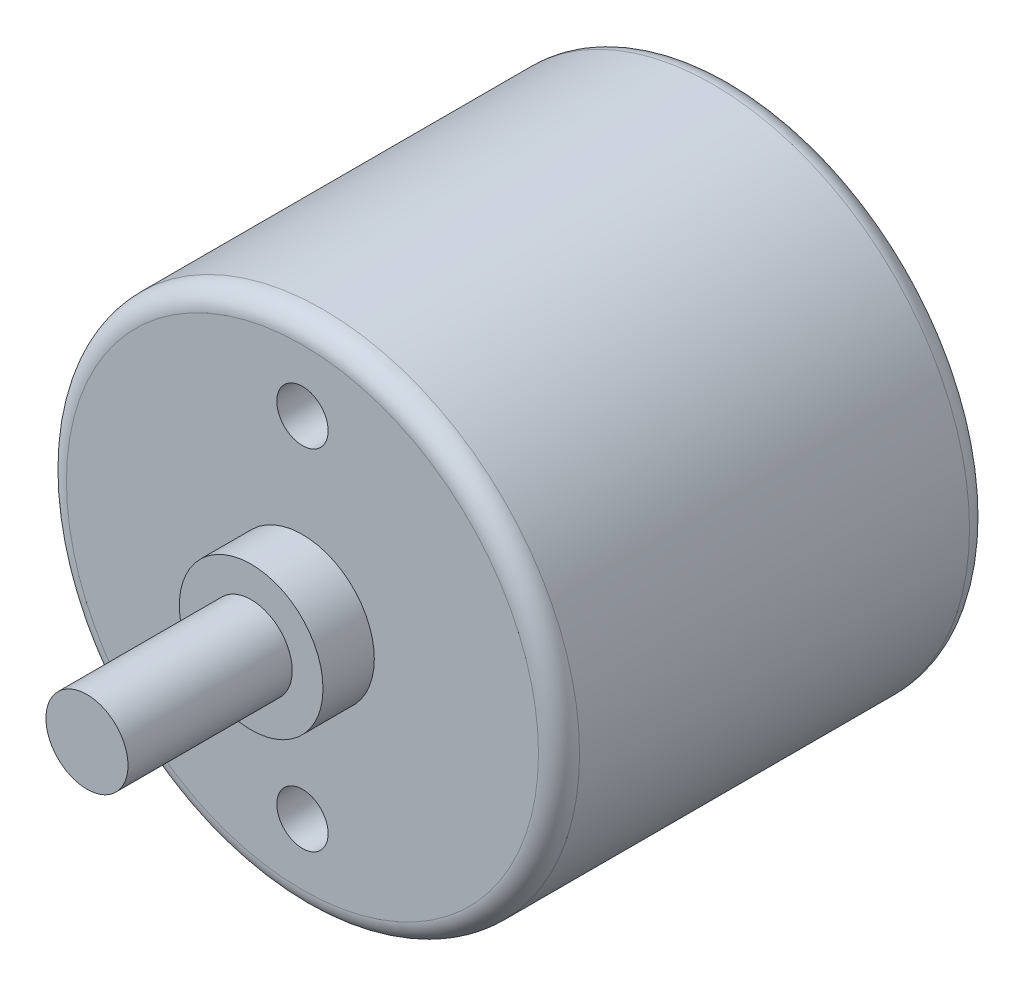
ISO-10303-21;
HEADER;
FILE_DESCRIPTION(('STEP AP214'),'2;1');
FILE_NAME('part.step','',(''),(''),'','','');
FILE_SCHEMA(('AUTOMOTIVE_DESIGN { 1 0 10303 214 1 1 1 1 }'));
ENDSEC;
DATA;
#1=APPLICATION_CONTEXT('core data for automotive mechanical design processes');
#2=APPLICATION_PROTOCOL_DEFINITION('international standard','automotive_design',2000,#1);
#3=PRODUCT_CONTEXT('',#1,'mechanical');
#4=PRODUCT('Part','Part','',(#3));
#5=PRODUCT_RELATED_PRODUCT_CATEGORY('part','',(#4));
#6=PRODUCT_DEFINITION_FORMATION('','',#4);
#7=PRODUCT_DEFINITION_CONTEXT('part definition',#1,'design');
#8=PRODUCT_DEFINITION('design','',#6,#7);
#9=PRODUCT_DEFINITION_SHAPE('','',#8);
#10=(LENGTH_UNIT() NAMED_UNIT(*) SI_UNIT(.MILLI.,.METRE.));
#11=(NAMED_UNIT(*) PLANE_ANGLE_UNIT() SI_UNIT($,.RADIAN.));
#12=(NAMED_UNIT(*) SI_UNIT($,.STERADIAN.) SOLID_ANGLE_UNIT());
#13=UNCERTAINTY_MEASURE_WITH_UNIT(LENGTH_MEASURE(1.E-05),#10,'distance_accuracy_value','');
#14=(GEOMETRIC_REPRESENTATION_CONTEXT(3) GLOBAL_UNCERTAINTY_ASSIGNED_CONTEXT((#13)) GLOBAL_UNIT_ASSIGNED_CONTEXT((#10,
#11,#12)) REPRESENTATION_CONTEXT('',''));
#15=CARTESIAN_POINT('',(0.,0.,0.));
#16=DIRECTION('',(0.,0.,1.));
#17=DIRECTION('',(1.,0.,0.));
#18=AXIS2_PLACEMENT_3D('',#15,#16,#17);
#19=CARTESIAN_POINT('',(0.,0.,23.5));
#20=DIRECTION('',(0.,0.,1.));
#21=DIRECTION('',(1.,0.,0.));
#22=AXIS2_PLACEMENT_3D('',#19,#20,#21);
#23=PLANE('',#22);
#24=CARTESIAN_POINT('',(0.,0.,23.5));
#25=DIRECTION('',(0.,0.,1.));
#26=DIRECTION('',(1.,0.,0.));
#27=AXIS2_PLACEMENT_3D('',#24,#25,#26);
#28=CIRCLE('',#27,3.5);
#29=CARTESIAN_POINT('',(3.5,0.,23.5));
#30=VERTEX_POINT('',#29);
#31=EDGE_CURVE('E53',#30,#30,#28,.T.);
#32=ORIENTED_EDGE('',*,*,#31,.T.);
#33=EDGE_LOOP('',(#32));
#34=FACE_BOUND('',#33,.T.);
#35=CARTESIAN_POINT('',(0.,0.,23.5));
#36=DIRECTION('',(0.,0.,1.));
#37=DIRECTION('',(1.,0.,0.));
#38=AXIS2_PLACEMENT_3D('',#35,#36,#37);
#39=CIRCLE('',#38,2.);
#40=CARTESIAN_POINT('',(2.,0.,23.5));
#41=VERTEX_POINT('',#40);
#42=EDGE_CURVE('E60',#41,#41,#39,.T.);
#43=ORIENTED_EDGE('',*,*,#42,.F.);
#44=EDGE_LOOP('',(#43));
#45=FACE_BOUND('',#44,.T.);
#46=ADVANCED_FACE('F33',(#34,#45),#23,.T.);
#47=CARTESIAN_POINT('',(0.,0.,21.));
#48=DIRECTION('',(0.,0.,1.));
#49=DIRECTION('',(1.,0.,0.));
#50=AXIS2_PLACEMENT_3D('',#47,#48,#49);
#51=PLANE('',#50);
#52=CARTESIAN_POINT('',(-3.65088646996817E-13,-8.5,21.));
#53=DIRECTION('',(0.,0.,1.));
#54=DIRECTION('',(1.,0.,0.));
#55=AXIS2_PLACEMENT_3D('',#52,#53,#54);
#56=CIRCLE('',#55,1.25);
#57=CARTESIAN_POINT('',(1.24999999999964,-8.5,21.));
#58=VERTEX_POINT('',#57);
#59=EDGE_CURVE('E72',#58,#58,#56,.T.);
#60=ORIENTED_EDGE('',*,*,#59,.F.);
#61=EDGE_LOOP('',(#60));
#62=FACE_BOUND('',#61,.T.);
#63=CARTESIAN_POINT('',(-3.05599595380992E-13,8.5,21.));
#64=DIRECTION('',(0.,0.,1.));
#65=DIRECTION('',(1.,0.,0.));
#66=AXIS2_PLACEMENT_3D('',#63,#64,#65);
#67=CIRCLE('',#66,1.25);
#68=CARTESIAN_POINT('',(1.2499999999997,8.5,21.));
#69=VERTEX_POINT('',#68);
#70=EDGE_CURVE('E66',#69,#69,#67,.T.);
#71=ORIENTED_EDGE('',*,*,#70,.F.);
#72=EDGE_LOOP('',(#71));
#73=FACE_BOUND('',#72,.T.);
#74=CARTESIAN_POINT('',(0.,0.,21.));
#75=DIRECTION('',(0.,0.,1.));
#76=DIRECTION('',(1.,0.,0.));
#77=AXIS2_PLACEMENT_3D('',#74,#75,#76);
#78=CIRCLE('',#77,11.5);
#79=CARTESIAN_POINT('',(11.5,0.,21.));
#80=VERTEX_POINT('',#79);
#81=EDGE_CURVE('E10',#80,#80,#78,.T.);
#82=ORIENTED_EDGE('',*,*,#81,.T.);
#83=EDGE_LOOP('',(#82));
#84=FACE_BOUND('',#83,.T.);
#85=CARTESIAN_POINT('',(0.,0.,21.));
#86=DIRECTION('',(0.,0.,1.));
#87=DIRECTION('',(1.,0.,0.));
#88=AXIS2_PLACEMENT_3D('',#85,#86,#87);
#89=CIRCLE('',#88,3.5);
#90=CARTESIAN_POINT('',(3.5,0.,21.));
#91=VERTEX_POINT('',#90);
#92=EDGE_CURVE('E54',#91,#91,#89,.T.);
#93=ORIENTED_EDGE('',*,*,#92,.F.);
#94=EDGE_LOOP('',(#93));
#95=FACE_BOUND('',#94,.T.);
#96=ADVANCED_FACE('F87',(#62,#73,#84,#95),#51,.T.);
#97=CARTESIAN_POINT('',(0.,0.,21.));
#98=DIRECTION('',(0.,0.,-1.));
#99=DIRECTION('',(-1.,0.,0.));
#100=AXIS2_PLACEMENT_3D('',#97,#98,#99);
#101=CYLINDRICAL_SURFACE('',#100,12.5);
#102=CARTESIAN_POINT('',(0.,0.,1.));
#103=DIRECTION('',(0.,0.,1.));
#104=DIRECTION('',(1.,0.,0.));
#105=AXIS2_PLACEMENT_3D('',#102,#103,#104);
#106=CIRCLE('',#105,12.5);
#107=CARTESIAN_POINT('',(-12.5,0.,1.));
#108=VERTEX_POINT('',#107);
#109=EDGE_CURVE('E44',#108,#108,#106,.T.);
#110=CARTESIAN_POINT('',(0.,0.,20.));
#111=DIRECTION('',(0.,0.,1.));
#112=DIRECTION('',(1.,0.,0.));
#113=AXIS2_PLACEMENT_3D('',#110,#111,#112);
#114=CIRCLE('',#113,12.5);
#115=CARTESIAN_POINT('',(-12.5,0.,20.));
#116=VERTEX_POINT('',#115);
#117=EDGE_CURVE('E48',#116,#116,#114,.F.);
#118=CARTESIAN_POINT('',(-12.5,0.,1.));
#119=CARTESIAN_POINT('',(-12.5,0.,1.19791666666667));
#120=CARTESIAN_POINT('',(-12.5,0.,1.39583333333333));
#121=CARTESIAN_POINT('',(-12.5,0.,1.79166666666667));
#122=CARTESIAN_POINT('',(-12.5,0.,1.98958333333334));
#123=CARTESIAN_POINT('',(-12.5,0.,2.38541666666667));
#124=CARTESIAN_POINT('',(-12.5,0.,2.58333333333334));
#125=CARTESIAN_POINT('',(-12.5,0.,2.97916666666667));
#126=CARTESIAN_POINT('',(-12.5,0.,3.17708333333334));
#127=CARTESIAN_POINT('',(-12.5,0.,3.57291666666667));
#128=CARTESIAN_POINT('',(-12.5,0.,3.77083333333333));
#129=CARTESIAN_POINT('',(-12.5,0.,4.16666666666667));
#130=CARTESIAN_POINT('',(-12.5,0.,4.36458333333333));
#131=CARTESIAN_POINT('',(-12.5,0.,4.76041666666667));
#132=CARTESIAN_POINT('',(-12.5,0.,4.95833333333333));
#133=CARTESIAN_POINT('',(-12.5,0.,5.35416666666667));
#134=CARTESIAN_POINT('',(-12.5,0.,5.55208333333333));
#135=CARTESIAN_POINT('',(-12.5,0.,5.94791666666667));
#136=CARTESIAN_POINT('',(-12.5,0.,6.14583333333333));
#137=CARTESIAN_POINT('',(-12.5,0.,6.54166666666667));
#138=CARTESIAN_POINT('',(-12.5,0.,6.73958333333333));
#139=CARTESIAN_POINT('',(-12.5,0.,7.13541666666667));
#140=CARTESIAN_POINT('',(-12.5,0.,7.33333333333333));
#141=CARTESIAN_POINT('',(-12.5,0.,7.72916666666667));
#142=CARTESIAN_POINT('',(-12.5,0.,7.92708333333333));
#143=CARTESIAN_POINT('',(-12.5,0.,8.32291666666667));
#144=CARTESIAN_POINT('',(-12.5,0.,8.52083333333333));
#145=CARTESIAN_POINT('',(-12.5,0.,8.91666666666667));
#146=CARTESIAN_POINT('',(-12.5,0.,9.11458333333333));
#147=CARTESIAN_POINT('',(-12.5,0.,9.51041666666667));
#148=CARTESIAN_POINT('',(-12.5,0.,9.70833333333333));
#149=CARTESIAN_POINT('',(-12.5,0.,10.1041666666667));
#150=CARTESIAN_POINT('',(-12.5,0.,10.3020833333333));
#151=CARTESIAN_POINT('',(-12.5,0.,10.6979166666667));
#152=CARTESIAN_POINT('',(-12.5,0.,10.8958333333333));
#153=CARTESIAN_POINT('',(-12.5,0.,11.2916666666667));
#154=CARTESIAN_POINT('',(-12.5,0.,11.4895833333333));
#155=CARTESIAN_POINT('',(-12.5,0.,11.8854166666667));
#156=CARTESIAN_POINT('',(-12.5,0.,12.0833333333333));
#157=CARTESIAN_POINT('',(-12.5,0.,12.4791666666667));
#158=CARTESIAN_POINT('',(-12.5,0.,12.6770833333333));
#159=CARTESIAN_POINT('',(-12.5,0.,13.0729166666667));
#160=CARTESIAN_POINT('',(-12.5,0.,13.2708333333333));
#161=CARTESIAN_POINT('',(-12.5,0.,13.6666666666667));
#162=CARTESIAN_POINT('',(-12.5,0.,13.8645833333333));
#163=CARTESIAN_POINT('',(-12.5,0.,14.2604166666667));
#164=CARTESIAN_POINT('',(-12.5,0.,14.4583333333333));
#165=CARTESIAN_POINT('',(-12.5,0.,14.8541666666667));
#166=CARTESIAN_POINT('',(-12.5,0.,15.0520833333333));
#167=CARTESIAN_POINT('',(-12.5,0.,15.4479166666667));
#168=CARTESIAN_POINT('',(-12.5,0.,15.6458333333333));
#169=CARTESIAN_POINT('',(-12.5,0.,16.0416666666667));
#170=CARTESIAN_POINT('',(-12.5,0.,16.2395833333333));
#171=CARTESIAN_POINT('',(-12.5,0.,16.6354166666667));
#172=CARTESIAN_POINT('',(-12.5,0.,16.8333333333333));
#173=CARTESIAN_POINT('',(-12.5,0.,17.2291666666667));
#174=CARTESIAN_POINT('',(-12.5,0.,17.4270833333333));
#175=CARTESIAN_POINT('',(-12.5,0.,17.8229166666667));
#176=CARTESIAN_POINT('',(-12.5,0.,18.0208333333333));
#177=CARTESIAN_POINT('',(-12.5,0.,18.4166666666667));
#178=CARTESIAN_POINT('',(-12.5,0.,18.6145833333333));
#179=CARTESIAN_POINT('',(-12.5,0.,19.0104166666667));
#180=CARTESIAN_POINT('',(-12.5,0.,19.2083333333333));
#181=CARTESIAN_POINT('',(-12.5,0.,19.6041666666667));
#182=CARTESIAN_POINT('',(-12.5,0.,19.8020833333333));
#183=CARTESIAN_POINT('',(-12.5,0.,20.));
#184=B_SPLINE_CURVE_WITH_KNOTS('',3,(#118,#119,#120,#121,#122,#123,#124,#125,#126,#127,#128,
#129,#130,#131,#132,#133,#134,#135,#136,#137,#138,#139,#140,#141,#142,#143,#144,#145,#146,#147,
#148,#149,#150,#151,#152,#153,#154,#155,#156,#157,#158,#159,#160,#161,#162,#163,#164,#165,#166,
#167,#168,#169,#170,#171,#172,#173,#174,#175,#176,#177,#178,#179,#180,#181,#182,#183),
.UNSPECIFIED.,.F.,.F.,(4,2,2,2,2,2,2,2,2,2,2,2,2,2,2,2,2,2,2,2,2,2,2,2,2,2,2,2,2,2,2,2,4),(0.,
0.593750000000001,1.1875,1.78125,2.375,2.96875,3.5625,4.15625,4.75,5.34375,5.9375,6.53125,7.125,
7.71875,8.3125,8.90625,9.5,10.09375,10.6875,11.28125,11.875,12.46875,13.0625,13.65625,14.25,
14.84375,15.4375,16.03125,16.625,17.21875,17.8125,18.40625,19.),.UNSPECIFIED.);
#185=EDGE_CURVE('BSEAM90',#108,#116,#184,.T.);
#186=ORIENTED_EDGE('',*,*,#109,.T.);
#187=ORIENTED_EDGE('',*,*,#117,.T.);
#188=ORIENTED_EDGE('',*,*,#185,.T.);
#189=ORIENTED_EDGE('',*,*,#185,.F.);
#190=EDGE_LOOP('',(#186,#188,#187,#189));
#191=FACE_BOUND('',#190,.T.);
#192=ADVANCED_FACE('F90',(#191),#101,.T.);
#193=CARTESIAN_POINT('',(0.,0.,0.));
#194=DIRECTION('',(0.,0.,1.));
#195=DIRECTION('',(1.,0.,0.));
#196=AXIS2_PLACEMENT_3D('',#193,#194,#195);
#197=PLANE('',#196);
#198=CARTESIAN_POINT('',(0.,0.,0.));
#199=DIRECTION('',(0.,0.,1.));
#200=DIRECTION('',(1.,0.,0.));
#201=AXIS2_PLACEMENT_3D('',#198,#199,#200);
#202=CIRCLE('',#201,11.5);
#203=CARTESIAN_POINT('',(11.5,0.,0.));
#204=VERTEX_POINT('',#203);
#205=EDGE_CURVE('E40',#204,#204,#202,.F.);
#206=ORIENTED_EDGE('',*,*,#205,.T.);
#207=EDGE_LOOP('',(#206));
#208=FACE_BOUND('',#207,.T.);
#209=ADVANCED_FACE('F99',(#208),#197,.F.);
#210=CARTESIAN_POINT('',(0.,0.,23.5));
#211=DIRECTION('',(0.,0.,-1.));
#212=DIRECTION('',(-1.,0.,0.));
#213=AXIS2_PLACEMENT_3D('',#210,#211,#212);
#214=CYLINDRICAL_SURFACE('',#213,3.5);
#215=ORIENTED_EDGE('',*,*,#31,.F.);
#216=EDGE_LOOP('',(#215));
#217=FACE_BOUND('',#216,.T.);
#218=ORIENTED_EDGE('',*,*,#92,.T.);
#219=EDGE_LOOP('',(#218));
#220=FACE_BOUND('',#219,.T.);
#221=ADVANCED_FACE('F96',(#217,#220),#214,.T.);
#222=CARTESIAN_POINT('',(0.,0.,1.));
#223=DIRECTION('',(0.,0.,1.));
#224=DIRECTION('',(1.,0.,0.));
#225=AXIS2_PLACEMENT_3D('',#222,#223,#224);
#226=TOROIDAL_SURFACE('',#225,11.5,1.);
#227=ORIENTED_EDGE('',*,*,#205,.F.);
#228=EDGE_LOOP('',(#227));
#229=FACE_BOUND('',#228,.T.);
#230=ORIENTED_EDGE('',*,*,#109,.F.);
#231=EDGE_LOOP('',(#230));
#232=FACE_BOUND('',#231,.T.);
#233=ADVANCED_FACE('F98',(#229,#232),#226,.T.);
#234=CARTESIAN_POINT('',(0.,0.,20.));
#235=DIRECTION('',(0.,0.,1.));
#236=DIRECTION('',(1.,0.,0.));
#237=AXIS2_PLACEMENT_3D('',#234,#235,#236);
#238=TOROIDAL_SURFACE('',#237,11.5,1.);
#239=ORIENTED_EDGE('',*,*,#117,.F.);
#240=EDGE_LOOP('',(#239));
#241=FACE_BOUND('',#240,.T.);
#242=ORIENTED_EDGE('',*,*,#81,.F.);
#243=EDGE_LOOP('',(#242));
#244=FACE_BOUND('',#243,.T.);
#245=ADVANCED_FACE('F35',(#241,#244),#238,.T.);
#246=CARTESIAN_POINT('',(0.,0.,31.5));
#247=DIRECTION('',(0.,0.,-1.));
#248=DIRECTION('',(-1.,0.,0.));
#249=AXIS2_PLACEMENT_3D('',#246,#247,#248);
#250=CYLINDRICAL_SURFACE('',#249,2.);
#251=CARTESIAN_POINT('',(0.,0.,31.5));
#252=DIRECTION('',(0.,0.,1.));
#253=DIRECTION('',(1.,0.,0.));
#254=AXIS2_PLACEMENT_3D('',#251,#252,#253);
#255=CIRCLE('',#254,2.);
#256=CARTESIAN_POINT('',(2.,0.,31.5));
#257=VERTEX_POINT('',#256);
#258=EDGE_CURVE('E57',#257,#257,#255,.T.);
#259=ORIENTED_EDGE('',*,*,#258,.F.);
#260=EDGE_LOOP('',(#259));
#261=FACE_BOUND('',#260,.T.);
#262=ORIENTED_EDGE('',*,*,#42,.T.);
#263=EDGE_LOOP('',(#262));
#264=FACE_BOUND('',#263,.T.);
#265=ADVANCED_FACE('F116',(#261,#264),#250,.T.);
#266=CARTESIAN_POINT('',(0.,0.,31.5));
#267=DIRECTION('',(0.,0.,1.));
#268=DIRECTION('',(1.,0.,0.));
#269=AXIS2_PLACEMENT_3D('',#266,#267,#268);
#270=PLANE('',#269);
#271=ORIENTED_EDGE('',*,*,#258,.T.);
#272=EDGE_LOOP('',(#271));
#273=FACE_BOUND('',#272,.T.);
#274=ADVANCED_FACE('F119',(#273),#270,.T.);
#275=CARTESIAN_POINT('',(-3.05599595380992E-13,8.5,11.));
#276=DIRECTION('',(0.,0.,1.));
#277=DIRECTION('',(1.,0.,0.));
#278=AXIS2_PLACEMENT_3D('',#275,#276,#277);
#279=CYLINDRICAL_SURFACE('',#278,1.25);
#280=CARTESIAN_POINT('',(-3.05599595380992E-13,8.5,11.));
#281=DIRECTION('',(0.,0.,1.));
#282=DIRECTION('',(1.,0.,0.));
#283=AXIS2_PLACEMENT_3D('',#280,#281,#282);
#284=CIRCLE('',#283,1.25);
#285=CARTESIAN_POINT('',(1.2499999999997,8.5,11.));
#286=VERTEX_POINT('',#285);
#287=EDGE_CURVE('E63',#286,#286,#284,.T.);
#288=ORIENTED_EDGE('',*,*,#287,.F.);
#289=EDGE_LOOP('',(#288));
#290=FACE_BOUND('',#289,.T.);
#291=ORIENTED_EDGE('',*,*,#70,.T.);
#292=EDGE_LOOP('',(#291));
#293=FACE_BOUND('',#292,.T.);
#294=ADVANCED_FACE('F123',(#290,#293),#279,.F.);
#295=CARTESIAN_POINT('',(-3.05599595380992E-13,8.5,11.));
#296=DIRECTION('',(0.,0.,1.));
#297=DIRECTION('',(1.,0.,0.));
#298=AXIS2_PLACEMENT_3D('',#295,#296,#297);
#299=PLANE('',#298);
#300=ORIENTED_EDGE('',*,*,#287,.T.);
#301=EDGE_LOOP('',(#300));
#302=FACE_BOUND('',#301,.T.);
#303=ADVANCED_FACE('F83',(#302),#299,.T.);
#304=CARTESIAN_POINT('',(-3.65088646996817E-13,-8.5,11.));
#305=DIRECTION('',(0.,0.,1.));
#306=DIRECTION('',(1.,0.,0.));
#307=AXIS2_PLACEMENT_3D('',#304,#305,#306);
#308=CYLINDRICAL_SURFACE('',#307,1.25);
#309=CARTESIAN_POINT('',(-3.65088646996817E-13,-8.5,11.));
#310=DIRECTION('',(0.,0.,1.));
#311=DIRECTION('',(1.,0.,0.));
#312=AXIS2_PLACEMENT_3D('',#309,#310,#311);
#313=CIRCLE('',#312,1.25);
#314=CARTESIAN_POINT('',(1.24999999999964,-8.5,11.));
#315=VERTEX_POINT('',#314);
#316=EDGE_CURVE('E69',#315,#315,#313,.T.);
#317=ORIENTED_EDGE('',*,*,#316,.F.);
#318=EDGE_LOOP('',(#317));
#319=FACE_BOUND('',#318,.T.);
#320=ORIENTED_EDGE('',*,*,#59,.T.);
#321=EDGE_LOOP('',(#320));
#322=FACE_BOUND('',#321,.T.);
#323=ADVANCED_FACE('F80',(#319,#322),#308,.F.);
#324=CARTESIAN_POINT('',(-3.65088646996817E-13,-8.5,11.));
#325=DIRECTION('',(0.,0.,1.));
#326=DIRECTION('',(1.,0.,0.));
#327=AXIS2_PLACEMENT_3D('',#324,#325,#326);
#328=PLANE('',#327);
#329=ORIENTED_EDGE('',*,*,#316,.T.);
#330=EDGE_LOOP('',(#329));
#331=FACE_BOUND('',#330,.T.);
#332=ADVANCED_FACE('F78',(#331),#328,.T.);
#333=CLOSED_SHELL('',(#46,#96,#192,#209,#221,#233,#245,#265,#274,#294,#303,#323,#332));
#334=MANIFOLD_SOLID_BREP('B2',#333);
#335=ADVANCED_BREP_SHAPE_REPRESENTATION('',(#18,#334),#14);
#336=SHAPE_DEFINITION_REPRESENTATION(#9,#335);
ENDSEC;
END-ISO-10303-21;
